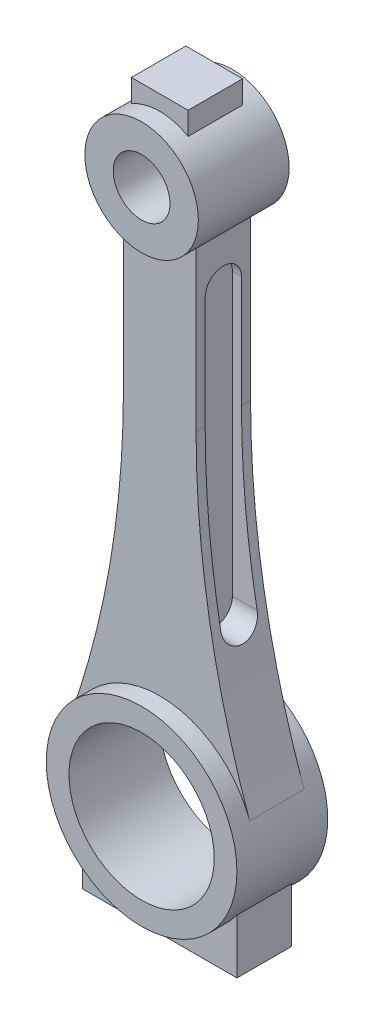
ISO-10303-21;
HEADER;
FILE_DESCRIPTION(('STEP AP214'),'2;1');
FILE_NAME('part.step','',(''),(''),'','','');
FILE_SCHEMA(('AUTOMOTIVE_DESIGN { 1 0 10303 214 1 1 1 1 }'));
ENDSEC;
DATA;
#1=APPLICATION_CONTEXT('core data for automotive mechanical design processes');
#2=APPLICATION_PROTOCOL_DEFINITION('international standard','automotive_design',2000,#1);
#3=PRODUCT_CONTEXT('',#1,'mechanical');
#4=PRODUCT('Part','Part','',(#3));
#5=PRODUCT_RELATED_PRODUCT_CATEGORY('part','',(#4));
#6=PRODUCT_DEFINITION_FORMATION('','',#4);
#7=PRODUCT_DEFINITION_CONTEXT('part definition',#1,'design');
#8=PRODUCT_DEFINITION('design','',#6,#7);
#9=PRODUCT_DEFINITION_SHAPE('','',#8);
#10=(LENGTH_UNIT() NAMED_UNIT(*) SI_UNIT(.MILLI.,.METRE.));
#11=(NAMED_UNIT(*) PLANE_ANGLE_UNIT() SI_UNIT($,.RADIAN.));
#12=(NAMED_UNIT(*) SI_UNIT($,.STERADIAN.) SOLID_ANGLE_UNIT());
#13=UNCERTAINTY_MEASURE_WITH_UNIT(LENGTH_MEASURE(1.E-05),#10,'distance_accuracy_value','');
#14=(GEOMETRIC_REPRESENTATION_CONTEXT(3) GLOBAL_UNCERTAINTY_ASSIGNED_CONTEXT((#13)) GLOBAL_UNIT_ASSIGNED_CONTEXT((#10,
#11,#12)) REPRESENTATION_CONTEXT('',''));
#15=CARTESIAN_POINT('',(0.,0.,0.));
#16=DIRECTION('',(0.,0.,1.));
#17=DIRECTION('',(1.,0.,0.));
#18=AXIS2_PLACEMENT_3D('',#15,#16,#17);
#19=CARTESIAN_POINT('',(212.132819979024,75.3953136438508,6.));
#20=DIRECTION('',(0.,0.,-1.));
#21=DIRECTION('',(-1.,0.,0.));
#22=AXIS2_PLACEMENT_3D('',#19,#20,#21);
#23=CYLINDRICAL_SURFACE('',#22,204.132819979024);
#24=CARTESIAN_POINT('',(11.4544735884215,38.,-4.00000000000001));
#25=CARTESIAN_POINT('',(11.4757515518411,37.885808633556,-4.00000967356236));
#26=CARTESIAN_POINT('',(11.4971278489319,37.7716411229783,-3.9951101211208));
#27=CARTESIAN_POINT('',(11.5399210356049,37.544152772884,-3.97557755361704));
#28=CARTESIAN_POINT('',(11.5613379239584,37.4308319082382,-3.9609448286138));
#29=CARTESIAN_POINT('',(11.6040518019029,37.2058589467753,-3.92203609087538));
#30=CARTESIAN_POINT('',(11.6253488219802,37.0942064124742,-3.89776265395078));
#31=CARTESIAN_POINT('',(11.6676599337569,36.8733657612217,-3.83975872762631));
#32=CARTESIAN_POINT('',(11.6886740293759,36.7641776101132,-3.80602836938937));
#33=CARTESIAN_POINT('',(11.7510730473326,36.4413470108117,-3.69089420326939));
#34=CARTESIAN_POINT('',(11.7918289081029,36.2323636826891,-3.59553432969808));
#35=CARTESIAN_POINT('',(11.8702126062763,35.833491871712,-3.37027556179513));
#36=CARTESIAN_POINT('',(11.9078413597511,35.643597793309,-3.24038682968163));
#37=CARTESIAN_POINT('',(11.9784728244352,35.2894796680367,-2.950436910244));
#38=CARTESIAN_POINT('',(12.0115036519544,35.1250988255321,-2.79057453802655));
#39=CARTESIAN_POINT('',(12.0720036427705,34.8256035029567,-2.44449926104124));
#40=CARTESIAN_POINT('',(12.0994724370193,34.6904909648341,-2.25828460915734));
#41=CARTESIAN_POINT('',(12.1473413477104,34.4559602912754,-1.86832249559897));
#42=CARTESIAN_POINT('',(12.1678582991115,34.3559510460777,-1.66494499104501));
#43=CARTESIAN_POINT('',(12.201667760202,34.1915558050774,-1.24372237948288));
#44=CARTESIAN_POINT('',(12.2149615713728,34.1271633917176,-1.02587988675161));
#45=CARTESIAN_POINT('',(12.2336033492388,34.0369591960168,-0.586274812122712));
#46=CARTESIAN_POINT('',(12.2390950212482,34.0104496060439,-0.36466133556186));
#47=CARTESIAN_POINT('',(12.2423732155318,33.9946184843633,0.0799443502249376));
#48=CARTESIAN_POINT('',(12.2401601145853,34.0052951341723,0.302936491499031));
#49=CARTESIAN_POINT('',(12.2281765408432,34.0632127244266,0.741781925824313));
#50=CARTESIAN_POINT('',(12.2184766498272,34.1101121767817,0.957682365575701));
#51=CARTESIAN_POINT('',(12.1919895794175,34.2385791029979,1.37844153266758));
#52=CARTESIAN_POINT('',(12.1752023313576,34.3201469127454,1.58330015300714));
#53=CARTESIAN_POINT('',(12.1350793834177,34.5159552856904,1.977397761575));
#54=CARTESIAN_POINT('',(12.1117098081663,34.6303649264095,2.16654921549122));
#55=CARTESIAN_POINT('',(12.0593260749272,34.8882465100265,2.52297125984127));
#56=CARTESIAN_POINT('',(12.0303117725959,35.0317191961119,2.69024129055298));
#57=CARTESIAN_POINT('',(11.9671383735568,35.3461665633751,3.00114206510914));
#58=CARTESIAN_POINT('',(11.9329025496515,35.5175545383741,3.14433904981939));
#59=CARTESIAN_POINT('',(11.8607975408037,35.8812712267655,3.40006280722764));
#60=CARTESIAN_POINT('',(11.8229268395297,36.0736086840292,3.51257670427656));
#61=CARTESIAN_POINT('',(11.744011046999,36.4777513253325,3.70593438635491));
#62=CARTESIAN_POINT('',(11.7029182624971,36.6898643551292,3.78611370956408));
#63=CARTESIAN_POINT('',(11.619535719839,37.1241795414682,3.90944320644274));
#64=CARTESIAN_POINT('',(11.5772477716993,37.3463667203578,3.95264656840455));
#65=CARTESIAN_POINT('',(11.5215540274852,37.6417241762258,3.98457340087694));
#66=CARTESIAN_POINT('',(11.5080944382148,37.7133147532121,3.99036111817268));
#67=CARTESIAN_POINT('',(11.481236818834,37.8565916807734,3.99806924003837));
#68=CARTESIAN_POINT('',(11.4678387235409,37.9282776734255,3.99999606757804));
#69=CARTESIAN_POINT('',(11.4544735884215,38.,3.99999999999999));
#70=B_SPLINE_CURVE_WITH_KNOTS('',3,(#24,#25,#26,#27,#28,#29,#30,#31,#32,#33,#34,#35,#36,#37,#38,
#39,#40,#41,#42,#43,#44,#45,#46,#47,#48,#49,#50,#51,#52,#53,#54,#55,#56,#57,#58,#59,#60,#61,#62,
#63,#64,#65,#66,#67,#68,#69),.UNSPECIFIED.,.F.,.F.,(4,2,2,2,2,2,2,2,2,2,2,2,2,2,2,2,2,2,2,2,2,2,
4),(0.,0.348357600629768,0.696704820295746,1.044959030908,1.39320841164154,2.0894785742732,
2.78554404346983,3.47714614167072,4.16879411353829,4.84816302804555,5.52740949173435,
6.19397531687088,6.86050854603355,7.52083364695974,8.18116514562693,8.84495910470897,
9.508770040179,10.1834922182609,10.8584970981523,11.546741507572,12.2339942357505,
12.4531452672714,12.6719314158043),.UNSPECIFIED.);
#71=CARTESIAN_POINT('',(11.4544735884215,38.,-4.00000000000001));
#72=VERTEX_POINT('',#71);
#73=CARTESIAN_POINT('',(11.4544735884215,38.,3.99999999999999));
#74=VERTEX_POINT('',#73);
#75=EDGE_CURVE('E482',#72,#74,#70,.T.);
#76=ORIENTED_EDGE('',*,*,#75,.T.);
#77=CARTESIAN_POINT('',(212.132819979024,75.3953136438508,4.));
#78=DIRECTION('',(0.,0.,-1.));
#79=DIRECTION('',(0.,1.,0.));
#80=AXIS2_PLACEMENT_3D('',#77,#78,#79);
#81=CIRCLE('',#80,204.132819979024);
#82=CARTESIAN_POINT('',(8.00000000000001,75.3953136438507,4.));
#83=VERTEX_POINT('',#82);
#84=EDGE_CURVE('E277',#74,#83,#81,.T.);
#85=ORIENTED_EDGE('',*,*,#84,.T.);
#86=DIRECTION('',(0.,0.,-1.));
#87=VECTOR('',#86,1.);
#88=CARTESIAN_POINT('',(8.00000000000001,75.3953136438507,6.));
#89=LINE('',#88,#87);
#90=CARTESIAN_POINT('',(8.00000000000001,75.3953136438507,6.));
#91=VERTEX_POINT('',#90);
#92=EDGE_CURVE('E451',#91,#83,#89,.T.);
#93=ORIENTED_EDGE('',*,*,#92,.F.);
#94=CARTESIAN_POINT('',(212.132819979024,75.3953136438508,6.));
#95=DIRECTION('',(0.,0.,1.));
#96=DIRECTION('',(1.,0.,0.));
#97=AXIS2_PLACEMENT_3D('',#94,#95,#96);
#98=CIRCLE('',#97,204.132819979024);
#99=CARTESIAN_POINT('',(19.7873824881444,7.03274443356765,6.));
#100=VERTEX_POINT('',#99);
#101=EDGE_CURVE('E387',#91,#100,#98,.T.);
#102=ORIENTED_EDGE('',*,*,#101,.T.);
#103=DIRECTION('',(0.,0.,-1.));
#104=VECTOR('',#103,1.);
#105=CARTESIAN_POINT('',(19.7873824881444,7.03274443356765,6.));
#106=LINE('',#105,#104);
#107=CARTESIAN_POINT('',(19.7873824881444,7.03274443356765,-6.));
#108=VERTEX_POINT('',#107);
#109=EDGE_CURVE('E409',#100,#108,#106,.T.);
#110=ORIENTED_EDGE('',*,*,#109,.T.);
#111=CARTESIAN_POINT('',(212.132819979024,75.3953136438508,-6.));
#112=DIRECTION('',(0.,0.,1.));
#113=DIRECTION('',(1.,0.,0.));
#114=AXIS2_PLACEMENT_3D('',#111,#112,#113);
#115=CIRCLE('',#114,204.132819979024);
#116=CARTESIAN_POINT('',(8.00000000000001,75.3953136438507,-6.));
#117=VERTEX_POINT('',#116);
#118=EDGE_CURVE('E380',#117,#108,#115,.T.);
#119=ORIENTED_EDGE('',*,*,#118,.F.);
#120=CARTESIAN_POINT('',(8.00000000000001,75.3953136438507,-4.));
#121=VERTEX_POINT('',#120);
#122=EDGE_CURVE('E450',#121,#117,#89,.T.);
#123=ORIENTED_EDGE('',*,*,#122,.F.);
#124=CARTESIAN_POINT('',(212.132819979024,75.3953136438508,-4.00000000000001));
#125=DIRECTION('',(0.,0.,1.));
#126=DIRECTION('',(0.,-1.,0.));
#127=AXIS2_PLACEMENT_3D('',#124,#125,#126);
#128=CIRCLE('',#127,204.132819979024);
#129=EDGE_CURVE('E65',#121,#72,#128,.T.);
#130=ORIENTED_EDGE('',*,*,#129,.T.);
#131=EDGE_LOOP('',(#76,#85,#93,#102,#110,#119,#123,#130));
#132=FACE_BOUND('',#131,.T.);
#133=ADVANCED_FACE('F41',(#132),#23,.F.);
#134=CARTESIAN_POINT('',(8.00000000000003,0.,6.));
#135=DIRECTION('',(1.,0.,0.));
#136=DIRECTION('',(0.,1.,0.));
#137=AXIS2_PLACEMENT_3D('',#134,#135,#136);
#138=PLANE('',#137);
#139=ORIENTED_EDGE('',*,*,#92,.T.);
#140=DIRECTION('',(0.,1.,0.));
#141=VECTOR('',#140,1.);
#142=CARTESIAN_POINT('',(8.00000000000003,0.,3.99999999999999));
#143=LINE('',#142,#141);
#144=CARTESIAN_POINT('',(8.00000000000002,100.,4.));
#145=VERTEX_POINT('',#144);
#146=EDGE_CURVE('E478',#83,#145,#143,.T.);
#147=ORIENTED_EDGE('',*,*,#146,.T.);
#148=CARTESIAN_POINT('',(8.00000000000001,100.,0.));
#149=DIRECTION('',(1.,0.,0.));
#150=DIRECTION('',(0.,1.,0.));
#151=AXIS2_PLACEMENT_3D('',#148,#149,#150);
#152=CIRCLE('',#151,4.);
#153=CARTESIAN_POINT('',(8.00000000000002,100.,-4.));
#154=VERTEX_POINT('',#153);
#155=EDGE_CURVE('E474',#145,#154,#152,.F.);
#156=ORIENTED_EDGE('',*,*,#155,.T.);
#157=DIRECTION('',(0.,-1.,0.));
#158=VECTOR('',#157,1.);
#159=CARTESIAN_POINT('',(8.00000000000003,0.,-4.00000000000001));
#160=LINE('',#159,#158);
#161=EDGE_CURVE('E465',#154,#121,#160,.T.);
#162=ORIENTED_EDGE('',*,*,#161,.T.);
#163=ORIENTED_EDGE('',*,*,#122,.T.);
#164=DIRECTION('',(0.,-1.,0.));
#165=VECTOR('',#164,1.);
#166=CARTESIAN_POINT('',(8.00000000000003,0.,-6.));
#167=LINE('',#166,#165);
#168=CARTESIAN_POINT('',(8.00000000000001,110.395313643851,-6.));
#169=VERTEX_POINT('',#168);
#170=EDGE_CURVE('E413',#169,#117,#167,.T.);
#171=ORIENTED_EDGE('',*,*,#170,.F.);
#172=DIRECTION('',(0.,0.,-1.));
#173=VECTOR('',#172,1.);
#174=CARTESIAN_POINT('',(8.00000000000001,110.395313643851,6.));
#175=LINE('',#174,#173);
#176=CARTESIAN_POINT('',(8.00000000000001,110.395313643851,6.));
#177=VERTEX_POINT('',#176);
#178=EDGE_CURVE('E447',#177,#169,#175,.T.);
#179=ORIENTED_EDGE('',*,*,#178,.F.);
#180=DIRECTION('',(0.,-1.,0.));
#181=VECTOR('',#180,1.);
#182=CARTESIAN_POINT('',(8.00000000000003,0.,6.));
#183=LINE('',#182,#181);
#184=EDGE_CURVE('E391',#177,#91,#183,.T.);
#185=ORIENTED_EDGE('',*,*,#184,.T.);
#186=EDGE_LOOP('',(#139,#147,#156,#162,#163,#171,#179,#185));
#187=FACE_BOUND('',#186,.T.);
#188=ADVANCED_FACE('F609',(#187),#138,.T.);
#189=CARTESIAN_POINT('',(0.,120.,10.));
#190=DIRECTION('',(0.,0.,-1.));
#191=DIRECTION('',(-1.,0.,0.));
#192=AXIS2_PLACEMENT_3D('',#189,#190,#191);
#193=CYLINDRICAL_SURFACE('',#192,6.25);
#194=CARTESIAN_POINT('',(0.,120.,10.));
#195=DIRECTION('',(0.,0.,1.));
#196=DIRECTION('',(1.,0.,0.));
#197=AXIS2_PLACEMENT_3D('',#194,#195,#196);
#198=CIRCLE('',#197,6.25);
#199=CARTESIAN_POINT('',(6.25,120.,10.));
#200=VERTEX_POINT('',#199);
#201=EDGE_CURVE('E456',#200,#200,#198,.T.);
#202=ORIENTED_EDGE('',*,*,#201,.T.);
#203=EDGE_LOOP('',(#202));
#204=FACE_BOUND('',#203,.T.);
#205=CARTESIAN_POINT('',(0.,120.,-10.));
#206=DIRECTION('',(0.,0.,1.));
#207=DIRECTION('',(1.,0.,0.));
#208=AXIS2_PLACEMENT_3D('',#205,#206,#207);
#209=CIRCLE('',#208,6.25);
#210=CARTESIAN_POINT('',(6.25,120.,-10.));
#211=VERTEX_POINT('',#210);
#212=EDGE_CURVE('E455',#211,#211,#209,.T.);
#213=ORIENTED_EDGE('',*,*,#212,.F.);
#214=EDGE_LOOP('',(#213));
#215=FACE_BOUND('',#214,.T.);
#216=ADVANCED_FACE('F43',(#204,#215),#193,.F.);
#217=CARTESIAN_POINT('',(0.,120.,10.));
#218=DIRECTION('',(0.,0.,-1.));
#219=DIRECTION('',(-1.,0.,0.));
#220=AXIS2_PLACEMENT_3D('',#217,#218,#219);
#221=CYLINDRICAL_SURFACE('',#220,12.5);
#222=DIRECTION('',(0.,0.,-1.));
#223=VECTOR('',#222,1.);
#224=CARTESIAN_POINT('',(6.25000000000001,130.825317547305,6.));
#225=LINE('',#224,#223);
#226=CARTESIAN_POINT('',(6.25000000000001,130.825317547305,6.));
#227=VERTEX_POINT('',#226);
#228=CARTESIAN_POINT('',(6.25,130.825317547305,-6.));
#229=VERTEX_POINT('',#228);
#230=EDGE_CURVE('E366',#227,#229,#225,.T.);
#231=ORIENTED_EDGE('',*,*,#230,.F.);
#232=CARTESIAN_POINT('',(0.,120.,6.));
#233=DIRECTION('',(0.,0.,1.));
#234=DIRECTION('',(1.,0.,0.));
#235=AXIS2_PLACEMENT_3D('',#232,#233,#234);
#236=CIRCLE('',#235,12.5);
#237=CARTESIAN_POINT('',(-6.25,130.825317547305,6.));
#238=VERTEX_POINT('',#237);
#239=EDGE_CURVE('E327',#227,#238,#236,.T.);
#240=ORIENTED_EDGE('',*,*,#239,.T.);
#241=DIRECTION('',(0.,0.,-1.));
#242=VECTOR('',#241,1.);
#243=CARTESIAN_POINT('',(-6.25,130.825317547305,6.));
#244=LINE('',#243,#242);
#245=CARTESIAN_POINT('',(-6.25,130.825317547305,-6.));
#246=VERTEX_POINT('',#245);
#247=EDGE_CURVE('E343',#238,#246,#244,.T.);
#248=ORIENTED_EDGE('',*,*,#247,.T.);
#249=CARTESIAN_POINT('',(0.,120.,-6.));
#250=DIRECTION('',(0.,0.,1.));
#251=DIRECTION('',(1.,0.,0.));
#252=AXIS2_PLACEMENT_3D('',#249,#250,#251);
#253=CIRCLE('',#252,12.5);
#254=EDGE_CURVE('E326',#229,#246,#253,.T.);
#255=ORIENTED_EDGE('',*,*,#254,.F.);
#256=EDGE_LOOP('',(#231,#240,#248,#255));
#257=FACE_BOUND('',#256,.T.);
#258=DIRECTION('',(0.,0.,-1.));
#259=VECTOR('',#258,1.);
#260=CARTESIAN_POINT('',(-8.,110.395313643851,6.));
#261=LINE('',#260,#259);
#262=CARTESIAN_POINT('',(-8.,110.395313643851,6.));
#263=VERTEX_POINT('',#262);
#264=CARTESIAN_POINT('',(-8.,110.395313643851,-6.));
#265=VERTEX_POINT('',#264);
#266=EDGE_CURVE('E443',#263,#265,#261,.T.);
#267=ORIENTED_EDGE('',*,*,#266,.F.);
#268=CARTESIAN_POINT('',(0.,120.,6.));
#269=DIRECTION('',(0.,0.,1.));
#270=DIRECTION('',(1.,0.,0.));
#271=AXIS2_PLACEMENT_3D('',#268,#269,#270);
#272=CIRCLE('',#271,12.5);
#273=EDGE_CURVE('E396',#263,#177,#272,.T.);
#274=ORIENTED_EDGE('',*,*,#273,.T.);
#275=ORIENTED_EDGE('',*,*,#178,.T.);
#276=CARTESIAN_POINT('',(0.,120.,-6.));
#277=DIRECTION('',(0.,0.,1.));
#278=DIRECTION('',(1.,0.,0.));
#279=AXIS2_PLACEMENT_3D('',#276,#277,#278);
#280=CIRCLE('',#279,12.5);
#281=EDGE_CURVE('E417',#265,#169,#280,.T.);
#282=ORIENTED_EDGE('',*,*,#281,.F.);
#283=EDGE_LOOP('',(#267,#274,#275,#282));
#284=FACE_BOUND('',#283,.T.);
#285=CARTESIAN_POINT('',(0.,120.,10.));
#286=DIRECTION('',(0.,0.,1.));
#287=DIRECTION('',(1.,0.,0.));
#288=AXIS2_PLACEMENT_3D('',#285,#286,#287);
#289=CIRCLE('',#288,12.5);
#290=CARTESIAN_POINT('',(12.5,120.,10.));
#291=VERTEX_POINT('',#290);
#292=EDGE_CURVE('E460',#291,#291,#289,.T.);
#293=ORIENTED_EDGE('',*,*,#292,.F.);
#294=EDGE_LOOP('',(#293));
#295=FACE_BOUND('',#294,.T.);
#296=CARTESIAN_POINT('',(0.,120.,-10.));
#297=DIRECTION('',(0.,0.,1.));
#298=DIRECTION('',(1.,0.,0.));
#299=AXIS2_PLACEMENT_3D('',#296,#297,#298);
#300=CIRCLE('',#299,12.5);
#301=CARTESIAN_POINT('',(12.5,120.,-10.));
#302=VERTEX_POINT('',#301);
#303=EDGE_CURVE('E461',#302,#302,#300,.T.);
#304=ORIENTED_EDGE('',*,*,#303,.T.);
#305=EDGE_LOOP('',(#304));
#306=FACE_BOUND('',#305,.T.);
#307=ADVANCED_FACE('F644',(#257,#284,#295,#306),#221,.T.);
#308=CARTESIAN_POINT('',(0.,0.,10.));
#309=DIRECTION('',(0.,0.,1.));
#310=DIRECTION('',(1.,0.,0.));
#311=AXIS2_PLACEMENT_3D('',#308,#309,#310);
#312=PLANE('',#311);
#313=ORIENTED_EDGE('',*,*,#201,.F.);
#314=EDGE_LOOP('',(#313));
#315=FACE_BOUND('',#314,.T.);
#316=ORIENTED_EDGE('',*,*,#292,.T.);
#317=EDGE_LOOP('',(#316));
#318=FACE_BOUND('',#317,.T.);
#319=ADVANCED_FACE('F826',(#315,#318),#312,.T.);
#320=CARTESIAN_POINT('',(0.,0.,-10.));
#321=DIRECTION('',(0.,0.,1.));
#322=DIRECTION('',(1.,0.,0.));
#323=AXIS2_PLACEMENT_3D('',#320,#321,#322);
#324=PLANE('',#323);
#325=ORIENTED_EDGE('',*,*,#212,.T.);
#326=EDGE_LOOP('',(#325));
#327=FACE_BOUND('',#326,.T.);
#328=ORIENTED_EDGE('',*,*,#303,.F.);
#329=EDGE_LOOP('',(#328));
#330=FACE_BOUND('',#329,.T.);
#331=ADVANCED_FACE('F835',(#327,#330),#324,.F.);
#332=CARTESIAN_POINT('',(-7.99999999999999,0.,6.));
#333=DIRECTION('',(1.,0.,0.));
#334=DIRECTION('',(0.,1.,0.));
#335=AXIS2_PLACEMENT_3D('',#332,#333,#334);
#336=PLANE('',#335);
#337=DIRECTION('',(0.,0.,-1.));
#338=VECTOR('',#337,1.);
#339=CARTESIAN_POINT('',(-7.99999999999999,75.3953136438507,6.));
#340=LINE('',#339,#338);
#341=CARTESIAN_POINT('',(-7.99999999999995,75.3953136438507,-4.00000000000001));
#342=VERTEX_POINT('',#341);
#343=CARTESIAN_POINT('',(-7.99999999999999,75.3953136438507,-6.));
#344=VERTEX_POINT('',#343);
#345=EDGE_CURVE('E438',#342,#344,#340,.T.);
#346=ORIENTED_EDGE('',*,*,#345,.F.);
#347=DIRECTION('',(0.,1.,0.));
#348=VECTOR('',#347,1.);
#349=CARTESIAN_POINT('',(-7.99999999999999,0.,-4.00000000000001));
#350=LINE('',#349,#348);
#351=CARTESIAN_POINT('',(-8.,100.,-4.));
#352=VERTEX_POINT('',#351);
#353=EDGE_CURVE('E243',#342,#352,#350,.T.);
#354=ORIENTED_EDGE('',*,*,#353,.T.);
#355=CARTESIAN_POINT('',(-8.,100.,0.));
#356=DIRECTION('',(1.,0.,0.));
#357=DIRECTION('',(0.,1.,0.));
#358=AXIS2_PLACEMENT_3D('',#355,#356,#357);
#359=CIRCLE('',#358,4.);
#360=CARTESIAN_POINT('',(-8.,100.,4.));
#361=VERTEX_POINT('',#360);
#362=EDGE_CURVE('E11',#352,#361,#359,.T.);
#363=ORIENTED_EDGE('',*,*,#362,.T.);
#364=DIRECTION('',(0.,-1.,0.));
#365=VECTOR('',#364,1.);
#366=CARTESIAN_POINT('',(-7.99999999999999,0.,3.99999999999999));
#367=LINE('',#366,#365);
#368=CARTESIAN_POINT('',(-7.99999999999995,75.3953136438507,4.));
#369=VERTEX_POINT('',#368);
#370=EDGE_CURVE('E207',#361,#369,#367,.T.);
#371=ORIENTED_EDGE('',*,*,#370,.T.);
#372=CARTESIAN_POINT('',(-7.99999999999999,75.3953136438507,6.));
#373=VERTEX_POINT('',#372);
#374=EDGE_CURVE('E439',#373,#369,#340,.T.);
#375=ORIENTED_EDGE('',*,*,#374,.F.);
#376=DIRECTION('',(0.,-1.,0.));
#377=VECTOR('',#376,1.);
#378=CARTESIAN_POINT('',(-7.99999999999999,0.,6.));
#379=LINE('',#378,#377);
#380=EDGE_CURVE('E399',#263,#373,#379,.T.);
#381=ORIENTED_EDGE('',*,*,#380,.F.);
#382=ORIENTED_EDGE('',*,*,#266,.T.);
#383=DIRECTION('',(0.,-1.,0.));
#384=VECTOR('',#383,1.);
#385=CARTESIAN_POINT('',(-7.99999999999999,0.,-6.));
#386=LINE('',#385,#384);
#387=EDGE_CURVE('E421',#265,#344,#386,.T.);
#388=ORIENTED_EDGE('',*,*,#387,.T.);
#389=EDGE_LOOP('',(#346,#354,#363,#371,#375,#381,#382,#388));
#390=FACE_BOUND('',#389,.T.);
#391=ADVANCED_FACE('F581',(#390),#336,.F.);
#392=CARTESIAN_POINT('',(-212.132819979024,75.3953136438507,6.));
#393=DIRECTION('',(0.,0.,-1.));
#394=DIRECTION('',(-1.,0.,0.));
#395=AXIS2_PLACEMENT_3D('',#392,#393,#394);
#396=CYLINDRICAL_SURFACE('',#395,204.132819979024);
#397=CARTESIAN_POINT('',(-11.4544735884215,38.,3.99999999999999));
#398=CARTESIAN_POINT('',(-11.4757515518411,37.885808633556,4.00000967356234));
#399=CARTESIAN_POINT('',(-11.4971278489319,37.7716411229783,3.99511012112078));
#400=CARTESIAN_POINT('',(-11.5399210356049,37.544152772884,3.97557755361703));
#401=CARTESIAN_POINT('',(-11.5613379239584,37.4308319082382,3.96094482861378));
#402=CARTESIAN_POINT('',(-11.6040518019029,37.2058589467753,3.92203609087537));
#403=CARTESIAN_POINT('',(-11.6253488219802,37.0942064124742,3.89776265395076));
#404=CARTESIAN_POINT('',(-11.6676599337568,36.8733657612217,3.83975872762629));
#405=CARTESIAN_POINT('',(-11.6886740293759,36.7641776101132,3.80602836938935));
#406=CARTESIAN_POINT('',(-11.7510730473326,36.4413470108117,3.69089420326937));
#407=CARTESIAN_POINT('',(-11.7918289081029,36.2323636826891,3.59553432969806));
#408=CARTESIAN_POINT('',(-11.8702126062763,35.833491871712,3.37027556179512));
#409=CARTESIAN_POINT('',(-11.9078413597511,35.643597793309,3.24038682968162));
#410=CARTESIAN_POINT('',(-11.9784728244352,35.2894796680367,2.95043691024399));
#411=CARTESIAN_POINT('',(-12.0115036519544,35.1250988255321,2.79057453802654));
#412=CARTESIAN_POINT('',(-12.0720036427705,34.8256035029567,2.44449926104123));
#413=CARTESIAN_POINT('',(-12.0994724370193,34.6904909648341,2.25828460915732));
#414=CARTESIAN_POINT('',(-12.1473413477104,34.4559602912754,1.86832249559895));
#415=CARTESIAN_POINT('',(-12.1678582991114,34.3559510460777,1.66494499104499));
#416=CARTESIAN_POINT('',(-12.201667760202,34.1915558050774,1.24372237948286));
#417=CARTESIAN_POINT('',(-12.2149615713728,34.1271633917176,1.02587988675159));
#418=CARTESIAN_POINT('',(-12.2336033492387,34.0369591960168,0.586274812122691));
#419=CARTESIAN_POINT('',(-12.2390950212481,34.0104496060439,0.364661335561841));
#420=CARTESIAN_POINT('',(-12.2423732155318,33.9946184843632,-0.0799443502249548));
#421=CARTESIAN_POINT('',(-12.2401601145852,34.0052951341723,-0.302936491499048));
#422=CARTESIAN_POINT('',(-12.2281765408432,34.0632127244266,-0.741781925824327));
#423=CARTESIAN_POINT('',(-12.2184766498271,34.1101121767817,-0.957682365575715));
#424=CARTESIAN_POINT('',(-12.1919895794175,34.2385791029979,-1.37844153266759));
#425=CARTESIAN_POINT('',(-12.1752023313576,34.3201469127454,-1.58330015300716));
#426=CARTESIAN_POINT('',(-12.1350793834177,34.5159552856904,-1.97739776157502));
#427=CARTESIAN_POINT('',(-12.1117098081663,34.6303649264095,-2.16654921549124));
#428=CARTESIAN_POINT('',(-12.0593260749272,34.8882465100265,-2.52297125984129));
#429=CARTESIAN_POINT('',(-12.0303117725958,35.0317191961119,-2.690241290553));
#430=CARTESIAN_POINT('',(-11.9671383735568,35.3461665633751,-3.00114206510915));
#431=CARTESIAN_POINT('',(-11.9329025496514,35.5175545383741,-3.1443390498194));
#432=CARTESIAN_POINT('',(-11.8607975408037,35.8812712267655,-3.40006280722766));
#433=CARTESIAN_POINT('',(-11.8229268395298,36.0736086840292,-3.51257670427658));
#434=CARTESIAN_POINT('',(-11.744011046999,36.4777513253325,-3.70593438635493));
#435=CARTESIAN_POINT('',(-11.702918262497,36.6898643551292,-3.78611370956409));
#436=CARTESIAN_POINT('',(-11.6195357198389,37.1241795414682,-3.90944320644275));
#437=CARTESIAN_POINT('',(-11.5772477716992,37.3463667203578,-3.95264656840456));
#438=CARTESIAN_POINT('',(-11.5215540274852,37.6417241762258,-3.98457340087695));
#439=CARTESIAN_POINT('',(-11.5080944382148,37.713314753212,-3.9903611181727));
#440=CARTESIAN_POINT('',(-11.4812368188341,37.8565916807734,-3.99806924003838));
#441=CARTESIAN_POINT('',(-11.4678387235409,37.9282776734255,-3.99999606757806));
#442=CARTESIAN_POINT('',(-11.4544735884214,38.,-4.00000000000001));
#443=B_SPLINE_CURVE_WITH_KNOTS('',3,(#397,#398,#399,#400,#401,#402,#403,#404,#405,#406,#407,
#408,#409,#410,#411,#412,#413,#414,#415,#416,#417,#418,#419,#420,#421,#422,#423,#424,#425,#426,
#427,#428,#429,#430,#431,#432,#433,#434,#435,#436,#437,#438,#439,#440,#441,#442),.UNSPECIFIED.,
.F.,.F.,(4,2,2,2,2,2,2,2,2,2,2,2,2,2,2,2,2,2,2,2,2,2,4),(0.,0.348357600629778,0.696704820295753,
1.044959030908,1.39320841164154,2.0894785742732,2.78554404346983,3.47714614167072,
4.1687941135383,4.84816302804556,5.52740949173436,6.19397531687089,6.86050854603355,
7.52083364695974,8.18116514562693,8.84495910470897,9.508770040179,10.1834922182609,
10.8584970981523,11.546741507572,12.2339942357505,12.4531452672714,12.6719314158043),.UNSPECIFIED.);
#444=CARTESIAN_POINT('',(-11.4544735884215,38.,3.99999999999999));
#445=VERTEX_POINT('',#444);
#446=CARTESIAN_POINT('',(-11.4544735884215,38.,-4.00000000000001));
#447=VERTEX_POINT('',#446);
#448=EDGE_CURVE('E583',#445,#447,#443,.T.);
#449=ORIENTED_EDGE('',*,*,#448,.T.);
#450=CARTESIAN_POINT('',(-212.132819979024,75.3953136438507,-4.00000000000001));
#451=DIRECTION('',(0.,0.,-1.));
#452=DIRECTION('',(0.,1.,0.));
#453=AXIS2_PLACEMENT_3D('',#450,#451,#452);
#454=CIRCLE('',#453,204.132819979024);
#455=EDGE_CURVE('E50',#447,#342,#454,.F.);
#456=ORIENTED_EDGE('',*,*,#455,.T.);
#457=ORIENTED_EDGE('',*,*,#345,.T.);
#458=CARTESIAN_POINT('',(-212.132819979024,75.3953136438507,-6.));
#459=DIRECTION('',(0.,0.,1.));
#460=DIRECTION('',(1.,0.,0.));
#461=AXIS2_PLACEMENT_3D('',#458,#459,#460);
#462=CIRCLE('',#461,204.132819979024);
#463=CARTESIAN_POINT('',(-19.7873824881444,7.03274443356764,-6.));
#464=VERTEX_POINT('',#463);
#465=EDGE_CURVE('E425',#344,#464,#462,.F.);
#466=ORIENTED_EDGE('',*,*,#465,.T.);
#467=DIRECTION('',(0.,0.,-1.));
#468=VECTOR('',#467,1.);
#469=CARTESIAN_POINT('',(-19.7873824881444,7.03274443356764,6.));
#470=LINE('',#469,#468);
#471=CARTESIAN_POINT('',(-19.7873824881444,7.03274443356764,6.));
#472=VERTEX_POINT('',#471);
#473=EDGE_CURVE('E435',#472,#464,#470,.T.);
#474=ORIENTED_EDGE('',*,*,#473,.F.);
#475=CARTESIAN_POINT('',(-212.132819979024,75.3953136438507,6.));
#476=DIRECTION('',(0.,0.,1.));
#477=DIRECTION('',(1.,0.,0.));
#478=AXIS2_PLACEMENT_3D('',#475,#476,#477);
#479=CIRCLE('',#478,204.132819979024);
#480=EDGE_CURVE('E402',#373,#472,#479,.F.);
#481=ORIENTED_EDGE('',*,*,#480,.F.);
#482=ORIENTED_EDGE('',*,*,#374,.T.);
#483=CARTESIAN_POINT('',(-212.132819979024,75.3953136438507,4.));
#484=DIRECTION('',(0.,0.,1.));
#485=DIRECTION('',(0.,-1.,0.));
#486=AXIS2_PLACEMENT_3D('',#483,#484,#485);
#487=CIRCLE('',#486,204.132819979024);
#488=EDGE_CURVE('E492',#369,#445,#487,.F.);
#489=ORIENTED_EDGE('',*,*,#488,.T.);
#490=EDGE_LOOP('',(#449,#456,#457,#466,#474,#481,#482,#489));
#491=FACE_BOUND('',#490,.T.);
#492=ADVANCED_FACE('F573',(#491),#396,.F.);
#493=CARTESIAN_POINT('',(0.,0.,6.));
#494=DIRECTION('',(0.,0.,1.));
#495=DIRECTION('',(1.,0.,0.));
#496=AXIS2_PLACEMENT_3D('',#493,#494,#495);
#497=PLANE('',#496);
#498=ORIENTED_EDGE('',*,*,#101,.F.);
#499=ORIENTED_EDGE('',*,*,#184,.F.);
#500=ORIENTED_EDGE('',*,*,#273,.F.);
#501=ORIENTED_EDGE('',*,*,#380,.T.);
#502=ORIENTED_EDGE('',*,*,#480,.T.);
#503=CARTESIAN_POINT('',(0.,0.,6.));
#504=DIRECTION('',(0.,0.,1.));
#505=DIRECTION('',(1.,0.,0.));
#506=AXIS2_PLACEMENT_3D('',#503,#504,#505);
#507=CIRCLE('',#506,21.);
#508=EDGE_CURVE('E406',#100,#472,#507,.T.);
#509=ORIENTED_EDGE('',*,*,#508,.F.);
#510=EDGE_LOOP('',(#498,#499,#500,#501,#502,#509));
#511=FACE_BOUND('',#510,.T.);
#512=ADVANCED_FACE('F570',(#511),#497,.T.);
#513=CARTESIAN_POINT('',(0.,0.,-6.));
#514=DIRECTION('',(0.,0.,1.));
#515=DIRECTION('',(1.,0.,0.));
#516=AXIS2_PLACEMENT_3D('',#513,#514,#515);
#517=PLANE('',#516);
#518=ORIENTED_EDGE('',*,*,#118,.T.);
#519=CARTESIAN_POINT('',(0.,0.,-6.));
#520=DIRECTION('',(0.,0.,1.));
#521=DIRECTION('',(1.,0.,0.));
#522=AXIS2_PLACEMENT_3D('',#519,#520,#521);
#523=CIRCLE('',#522,21.);
#524=EDGE_CURVE('E392',#108,#464,#523,.T.);
#525=ORIENTED_EDGE('',*,*,#524,.T.);
#526=ORIENTED_EDGE('',*,*,#465,.F.);
#527=ORIENTED_EDGE('',*,*,#387,.F.);
#528=ORIENTED_EDGE('',*,*,#281,.T.);
#529=ORIENTED_EDGE('',*,*,#170,.T.);
#530=EDGE_LOOP('',(#518,#525,#526,#527,#528,#529));
#531=FACE_BOUND('',#530,.T.);
#532=ADVANCED_FACE('F568',(#531),#517,.F.);
#533=CARTESIAN_POINT('',(0.,0.,10.));
#534=DIRECTION('',(0.,0.,-1.));
#535=DIRECTION('',(-1.,0.,0.));
#536=AXIS2_PLACEMENT_3D('',#533,#534,#535);
#537=CYLINDRICAL_SURFACE('',#536,21.);
#538=DIRECTION('',(0.,0.,-1.));
#539=VECTOR('',#538,1.);
#540=CARTESIAN_POINT('',(-17.,-12.328828005938,6.));
#541=LINE('',#540,#539);
#542=CARTESIAN_POINT('',(-17.,-12.328828005938,6.));
#543=VERTEX_POINT('',#542);
#544=CARTESIAN_POINT('',(-17.,-12.328828005938,-6.));
#545=VERTEX_POINT('',#544);
#546=EDGE_CURVE('E315',#543,#545,#541,.T.);
#547=ORIENTED_EDGE('',*,*,#546,.F.);
#548=CARTESIAN_POINT('',(0.,0.,6.));
#549=DIRECTION('',(0.,0.,1.));
#550=DIRECTION('',(1.,0.,0.));
#551=AXIS2_PLACEMENT_3D('',#548,#549,#550);
#552=CIRCLE('',#551,21.);
#553=CARTESIAN_POINT('',(17.,-12.328828005938,6.));
#554=VERTEX_POINT('',#553);
#555=EDGE_CURVE('E291',#543,#554,#552,.T.);
#556=ORIENTED_EDGE('',*,*,#555,.T.);
#557=DIRECTION('',(0.,0.,-1.));
#558=VECTOR('',#557,1.);
#559=CARTESIAN_POINT('',(17.,-12.328828005938,6.));
#560=LINE('',#559,#558);
#561=CARTESIAN_POINT('',(17.,-12.328828005938,-6.));
#562=VERTEX_POINT('',#561);
#563=EDGE_CURVE('E319',#554,#562,#560,.T.);
#564=ORIENTED_EDGE('',*,*,#563,.T.);
#565=CARTESIAN_POINT('',(0.,0.,-6.));
#566=DIRECTION('',(0.,0.,1.));
#567=DIRECTION('',(1.,0.,0.));
#568=AXIS2_PLACEMENT_3D('',#565,#566,#567);
#569=CIRCLE('',#568,21.);
#570=EDGE_CURVE('E306',#545,#562,#569,.T.);
#571=ORIENTED_EDGE('',*,*,#570,.F.);
#572=EDGE_LOOP('',(#547,#556,#564,#571));
#573=FACE_BOUND('',#572,.T.);
#574=ORIENTED_EDGE('',*,*,#508,.T.);
#575=ORIENTED_EDGE('',*,*,#473,.T.);
#576=ORIENTED_EDGE('',*,*,#524,.F.);
#577=ORIENTED_EDGE('',*,*,#109,.F.);
#578=EDGE_LOOP('',(#574,#575,#576,#577));
#579=FACE_BOUND('',#578,.T.);
#580=CARTESIAN_POINT('',(0.,0.,10.));
#581=DIRECTION('',(0.,0.,1.));
#582=DIRECTION('',(1.,0.,0.));
#583=AXIS2_PLACEMENT_3D('',#580,#581,#582);
#584=CIRCLE('',#583,21.);
#585=CARTESIAN_POINT('',(21.,0.,10.));
#586=VERTEX_POINT('',#585);
#587=EDGE_CURVE('E371',#586,#586,#584,.T.);
#588=ORIENTED_EDGE('',*,*,#587,.F.);
#589=EDGE_LOOP('',(#588));
#590=FACE_BOUND('',#589,.T.);
#591=CARTESIAN_POINT('',(0.,0.,-10.));
#592=DIRECTION('',(0.,0.,1.));
#593=DIRECTION('',(1.,0.,0.));
#594=AXIS2_PLACEMENT_3D('',#591,#592,#593);
#595=CIRCLE('',#594,21.);
#596=CARTESIAN_POINT('',(21.,0.,-10.));
#597=VERTEX_POINT('',#596);
#598=EDGE_CURVE('E370',#597,#597,#595,.T.);
#599=ORIENTED_EDGE('',*,*,#598,.T.);
#600=EDGE_LOOP('',(#599));
#601=FACE_BOUND('',#600,.T.);
#602=ADVANCED_FACE('F564',(#573,#579,#590,#601),#537,.T.);
#603=CARTESIAN_POINT('',(0.,0.,10.));
#604=DIRECTION('',(0.,0.,-1.));
#605=DIRECTION('',(-1.,0.,0.));
#606=AXIS2_PLACEMENT_3D('',#603,#604,#605);
#607=CYLINDRICAL_SURFACE('',#606,16.);
#608=CARTESIAN_POINT('',(0.,0.,10.));
#609=DIRECTION('',(0.,0.,1.));
#610=DIRECTION('',(1.,0.,0.));
#611=AXIS2_PLACEMENT_3D('',#608,#609,#610);
#612=CIRCLE('',#611,16.);
#613=CARTESIAN_POINT('',(16.,0.,10.));
#614=VERTEX_POINT('',#613);
#615=EDGE_CURVE('E375',#614,#614,#612,.T.);
#616=ORIENTED_EDGE('',*,*,#615,.T.);
#617=EDGE_LOOP('',(#616));
#618=FACE_BOUND('',#617,.T.);
#619=CARTESIAN_POINT('',(0.,0.,-10.));
#620=DIRECTION('',(0.,0.,1.));
#621=DIRECTION('',(1.,0.,0.));
#622=AXIS2_PLACEMENT_3D('',#619,#620,#621);
#623=CIRCLE('',#622,16.);
#624=CARTESIAN_POINT('',(16.,0.,-10.));
#625=VERTEX_POINT('',#624);
#626=EDGE_CURVE('E376',#625,#625,#623,.T.);
#627=ORIENTED_EDGE('',*,*,#626,.F.);
#628=EDGE_LOOP('',(#627));
#629=FACE_BOUND('',#628,.T.);
#630=ADVANCED_FACE('F557',(#618,#629),#607,.F.);
#631=CARTESIAN_POINT('',(0.,0.,10.));
#632=DIRECTION('',(0.,0.,1.));
#633=DIRECTION('',(1.,0.,0.));
#634=AXIS2_PLACEMENT_3D('',#631,#632,#633);
#635=PLANE('',#634);
#636=ORIENTED_EDGE('',*,*,#587,.T.);
#637=EDGE_LOOP('',(#636));
#638=FACE_BOUND('',#637,.T.);
#639=ORIENTED_EDGE('',*,*,#615,.F.);
#640=EDGE_LOOP('',(#639));
#641=FACE_BOUND('',#640,.T.);
#642=ADVANCED_FACE('F554',(#638,#641),#635,.T.);
#643=CARTESIAN_POINT('',(0.,0.,-10.));
#644=DIRECTION('',(0.,0.,1.));
#645=DIRECTION('',(1.,0.,0.));
#646=AXIS2_PLACEMENT_3D('',#643,#644,#645);
#647=PLANE('',#646);
#648=ORIENTED_EDGE('',*,*,#598,.F.);
#649=EDGE_LOOP('',(#648));
#650=FACE_BOUND('',#649,.T.);
#651=ORIENTED_EDGE('',*,*,#626,.T.);
#652=EDGE_LOOP('',(#651));
#653=FACE_BOUND('',#652,.T.);
#654=ADVANCED_FACE('F552',(#650,#653),#647,.F.);
#655=CARTESIAN_POINT('',(6.2500000000001,0.,6.));
#656=DIRECTION('',(1.,0.,0.));
#657=DIRECTION('',(0.,1.,0.));
#658=AXIS2_PLACEMENT_3D('',#655,#656,#657);
#659=PLANE('',#658);
#660=DIRECTION('',(0.,-1.,0.));
#661=VECTOR('',#660,1.);
#662=CARTESIAN_POINT('',(6.2500000000001,0.,-6.));
#663=LINE('',#662,#661);
#664=CARTESIAN_POINT('',(6.25,135.825317547305,-6.));
#665=VERTEX_POINT('',#664);
#666=EDGE_CURVE('E347',#665,#229,#663,.T.);
#667=ORIENTED_EDGE('',*,*,#666,.F.);
#668=DIRECTION('',(0.,0.,-1.));
#669=VECTOR('',#668,1.);
#670=CARTESIAN_POINT('',(6.25,135.825317547305,6.));
#671=LINE('',#670,#669);
#672=CARTESIAN_POINT('',(6.25,135.825317547305,6.));
#673=VERTEX_POINT('',#672);
#674=EDGE_CURVE('E363',#673,#665,#671,.T.);
#675=ORIENTED_EDGE('',*,*,#674,.F.);
#676=DIRECTION('',(0.,-1.,0.));
#677=VECTOR('',#676,1.);
#678=CARTESIAN_POINT('',(6.2500000000001,0.,6.));
#679=LINE('',#678,#677);
#680=EDGE_CURVE('E330',#673,#227,#679,.T.);
#681=ORIENTED_EDGE('',*,*,#680,.T.);
#682=ORIENTED_EDGE('',*,*,#230,.T.);
#683=EDGE_LOOP('',(#667,#675,#681,#682));
#684=FACE_BOUND('',#683,.T.);
#685=ADVANCED_FACE('F548',(#684),#659,.T.);
#686=CARTESIAN_POINT('',(0.,135.825317547305,6.));
#687=DIRECTION('',(0.,1.,0.));
#688=DIRECTION('',(0.,0.,1.));
#689=AXIS2_PLACEMENT_3D('',#686,#687,#688);
#690=PLANE('',#689);
#691=DIRECTION('',(1.,0.,0.));
#692=VECTOR('',#691,1.);
#693=CARTESIAN_POINT('',(0.,135.825317547305,-6.));
#694=LINE('',#693,#692);
#695=CARTESIAN_POINT('',(-6.25,135.825317547305,-6.));
#696=VERTEX_POINT('',#695);
#697=EDGE_CURVE('E351',#696,#665,#694,.T.);
#698=ORIENTED_EDGE('',*,*,#697,.F.);
#699=DIRECTION('',(0.,0.,-1.));
#700=VECTOR('',#699,1.);
#701=CARTESIAN_POINT('',(-6.25,135.825317547305,6.));
#702=LINE('',#701,#700);
#703=CARTESIAN_POINT('',(-6.25,135.825317547305,6.));
#704=VERTEX_POINT('',#703);
#705=EDGE_CURVE('E360',#704,#696,#702,.T.);
#706=ORIENTED_EDGE('',*,*,#705,.F.);
#707=DIRECTION('',(1.,0.,0.));
#708=VECTOR('',#707,1.);
#709=CARTESIAN_POINT('',(0.,135.825317547305,6.));
#710=LINE('',#709,#708);
#711=EDGE_CURVE('E335',#704,#673,#710,.T.);
#712=ORIENTED_EDGE('',*,*,#711,.T.);
#713=ORIENTED_EDGE('',*,*,#674,.T.);
#714=EDGE_LOOP('',(#698,#706,#712,#713));
#715=FACE_BOUND('',#714,.T.);
#716=ADVANCED_FACE('F544',(#715),#690,.T.);
#717=CARTESIAN_POINT('',(-6.25,0.,6.));
#718=DIRECTION('',(-1.,0.,0.));
#719=DIRECTION('',(0.,0.,1.));
#720=AXIS2_PLACEMENT_3D('',#717,#718,#719);
#721=PLANE('',#720);
#722=DIRECTION('',(0.,1.,0.));
#723=VECTOR('',#722,1.);
#724=CARTESIAN_POINT('',(-6.25,0.,-6.));
#725=LINE('',#724,#723);
#726=EDGE_CURVE('E331',#246,#696,#725,.T.);
#727=ORIENTED_EDGE('',*,*,#726,.F.);
#728=ORIENTED_EDGE('',*,*,#247,.F.);
#729=DIRECTION('',(0.,1.,0.));
#730=VECTOR('',#729,1.);
#731=CARTESIAN_POINT('',(-6.25,0.,6.));
#732=LINE('',#731,#730);
#733=EDGE_CURVE('E339',#238,#704,#732,.T.);
#734=ORIENTED_EDGE('',*,*,#733,.T.);
#735=ORIENTED_EDGE('',*,*,#705,.T.);
#736=EDGE_LOOP('',(#727,#728,#734,#735));
#737=FACE_BOUND('',#736,.T.);
#738=ADVANCED_FACE('F537',(#737),#721,.T.);
#739=CARTESIAN_POINT('',(0.,0.,6.));
#740=DIRECTION('',(0.,0.,1.));
#741=DIRECTION('',(1.,0.,0.));
#742=AXIS2_PLACEMENT_3D('',#739,#740,#741);
#743=PLANE('',#742);
#744=ORIENTED_EDGE('',*,*,#239,.F.);
#745=ORIENTED_EDGE('',*,*,#680,.F.);
#746=ORIENTED_EDGE('',*,*,#711,.F.);
#747=ORIENTED_EDGE('',*,*,#733,.F.);
#748=EDGE_LOOP('',(#744,#745,#746,#747));
#749=FACE_BOUND('',#748,.T.);
#750=ADVANCED_FACE('F534',(#749),#743,.T.);
#751=CARTESIAN_POINT('',(0.,0.,-6.));
#752=DIRECTION('',(0.,0.,1.));
#753=DIRECTION('',(1.,0.,0.));
#754=AXIS2_PLACEMENT_3D('',#751,#752,#753);
#755=PLANE('',#754);
#756=ORIENTED_EDGE('',*,*,#254,.T.);
#757=ORIENTED_EDGE('',*,*,#726,.T.);
#758=ORIENTED_EDGE('',*,*,#697,.T.);
#759=ORIENTED_EDGE('',*,*,#666,.T.);
#760=EDGE_LOOP('',(#756,#757,#758,#759));
#761=FACE_BOUND('',#760,.T.);
#762=ADVANCED_FACE('F532',(#761),#755,.F.);
#763=CARTESIAN_POINT('',(0.,-24.328828005938,6.));
#764=DIRECTION('',(0.,1.,0.));
#765=DIRECTION('',(-1.,0.,0.));
#766=AXIS2_PLACEMENT_3D('',#763,#764,#765);
#767=PLANE('',#766);
#768=DIRECTION('',(1.,0.,0.));
#769=VECTOR('',#768,1.);
#770=CARTESIAN_POINT('',(0.,-24.328828005938,-6.));
#771=LINE('',#770,#769);
#772=CARTESIAN_POINT('',(-17.,-24.328828005938,-6.));
#773=VERTEX_POINT('',#772);
#774=CARTESIAN_POINT('',(17.,-24.328828005938,-6.));
#775=VERTEX_POINT('',#774);
#776=EDGE_CURVE('E281',#773,#775,#771,.T.);
#777=ORIENTED_EDGE('',*,*,#776,.T.);
#778=DIRECTION('',(0.,0.,-1.));
#779=VECTOR('',#778,1.);
#780=CARTESIAN_POINT('',(17.,-24.328828005938,6.));
#781=LINE('',#780,#779);
#782=CARTESIAN_POINT('',(17.,-24.328828005938,6.));
#783=VERTEX_POINT('',#782);
#784=EDGE_CURVE('E322',#783,#775,#781,.T.);
#785=ORIENTED_EDGE('',*,*,#784,.F.);
#786=DIRECTION('',(1.,0.,0.));
#787=VECTOR('',#786,1.);
#788=CARTESIAN_POINT('',(0.,-24.328828005938,6.));
#789=LINE('',#788,#787);
#790=CARTESIAN_POINT('',(-17.,-24.328828005938,6.));
#791=VERTEX_POINT('',#790);
#792=EDGE_CURVE('E282',#791,#783,#789,.T.);
#793=ORIENTED_EDGE('',*,*,#792,.F.);
#794=DIRECTION('',(0.,0.,-1.));
#795=VECTOR('',#794,1.);
#796=CARTESIAN_POINT('',(-17.,-24.328828005938,6.));
#797=LINE('',#796,#795);
#798=EDGE_CURVE('E298',#791,#773,#797,.T.);
#799=ORIENTED_EDGE('',*,*,#798,.T.);
#800=EDGE_LOOP('',(#777,#785,#793,#799));
#801=FACE_BOUND('',#800,.T.);
#802=ADVANCED_FACE('F528',(#801),#767,.F.);
#803=CARTESIAN_POINT('',(17.,0.,6.));
#804=DIRECTION('',(-1.,0.,0.));
#805=DIRECTION('',(0.,-1.,0.));
#806=AXIS2_PLACEMENT_3D('',#803,#804,#805);
#807=PLANE('',#806);
#808=DIRECTION('',(0.,1.,0.));
#809=VECTOR('',#808,1.);
#810=CARTESIAN_POINT('',(17.,0.,-6.));
#811=LINE('',#810,#809);
#812=EDGE_CURVE('E302',#775,#562,#811,.T.);
#813=ORIENTED_EDGE('',*,*,#812,.T.);
#814=ORIENTED_EDGE('',*,*,#563,.F.);
#815=DIRECTION('',(0.,1.,0.));
#816=VECTOR('',#815,1.);
#817=CARTESIAN_POINT('',(17.,0.,6.));
#818=LINE('',#817,#816);
#819=EDGE_CURVE('E286',#783,#554,#818,.T.);
#820=ORIENTED_EDGE('',*,*,#819,.F.);
#821=ORIENTED_EDGE('',*,*,#784,.T.);
#822=EDGE_LOOP('',(#813,#814,#820,#821));
#823=FACE_BOUND('',#822,.T.);
#824=ADVANCED_FACE('F524',(#823),#807,.F.);
#825=CARTESIAN_POINT('',(-17.,0.,6.));
#826=DIRECTION('',(-1.,0.,0.));
#827=DIRECTION('',(0.,0.,1.));
#828=AXIS2_PLACEMENT_3D('',#825,#826,#827);
#829=PLANE('',#828);
#830=DIRECTION('',(0.,1.,0.));
#831=VECTOR('',#830,1.);
#832=CARTESIAN_POINT('',(-17.,0.,-6.));
#833=LINE('',#832,#831);
#834=EDGE_CURVE('E287',#773,#545,#833,.T.);
#835=ORIENTED_EDGE('',*,*,#834,.F.);
#836=ORIENTED_EDGE('',*,*,#798,.F.);
#837=DIRECTION('',(0.,1.,0.));
#838=VECTOR('',#837,1.);
#839=CARTESIAN_POINT('',(-17.,0.,6.));
#840=LINE('',#839,#838);
#841=EDGE_CURVE('E294',#791,#543,#840,.T.);
#842=ORIENTED_EDGE('',*,*,#841,.T.);
#843=ORIENTED_EDGE('',*,*,#546,.T.);
#844=EDGE_LOOP('',(#835,#836,#842,#843));
#845=FACE_BOUND('',#844,.T.);
#846=ADVANCED_FACE('F517',(#845),#829,.T.);
#847=CARTESIAN_POINT('',(0.,0.,6.));
#848=DIRECTION('',(0.,0.,1.));
#849=DIRECTION('',(1.,0.,0.));
#850=AXIS2_PLACEMENT_3D('',#847,#848,#849);
#851=PLANE('',#850);
#852=ORIENTED_EDGE('',*,*,#792,.T.);
#853=ORIENTED_EDGE('',*,*,#819,.T.);
#854=ORIENTED_EDGE('',*,*,#555,.F.);
#855=ORIENTED_EDGE('',*,*,#841,.F.);
#856=EDGE_LOOP('',(#852,#853,#854,#855));
#857=FACE_BOUND('',#856,.T.);
#858=ADVANCED_FACE('F514',(#857),#851,.T.);
#859=CARTESIAN_POINT('',(0.,0.,-6.));
#860=DIRECTION('',(0.,0.,1.));
#861=DIRECTION('',(1.,0.,0.));
#862=AXIS2_PLACEMENT_3D('',#859,#860,#861);
#863=PLANE('',#862);
#864=ORIENTED_EDGE('',*,*,#776,.F.);
#865=ORIENTED_EDGE('',*,*,#834,.T.);
#866=ORIENTED_EDGE('',*,*,#570,.T.);
#867=ORIENTED_EDGE('',*,*,#812,.F.);
#868=EDGE_LOOP('',(#864,#865,#866,#867));
#869=FACE_BOUND('',#868,.T.);
#870=ADVANCED_FACE('F512',(#869),#863,.F.);
#871=CARTESIAN_POINT('',(21.,100.,0.));
#872=DIRECTION('',(-1.,0.,0.));
#873=DIRECTION('',(0.,0.,1.));
#874=AXIS2_PLACEMENT_3D('',#871,#872,#873);
#875=CYLINDRICAL_SURFACE('',#874,4.);
#876=DIRECTION('',(-1.,0.,0.));
#877=VECTOR('',#876,1.);
#878=CARTESIAN_POINT('',(21.,100.,4.));
#879=LINE('',#878,#877);
#880=CARTESIAN_POINT('',(6.,100.,4.));
#881=VERTEX_POINT('',#880);
#882=EDGE_CURVE('E272',#145,#881,#879,.T.);
#883=ORIENTED_EDGE('',*,*,#882,.T.);
#884=CARTESIAN_POINT('',(6.,100.,0.));
#885=DIRECTION('',(1.,0.,0.));
#886=DIRECTION('',(0.,0.,-1.));
#887=AXIS2_PLACEMENT_3D('',#884,#885,#886);
#888=CIRCLE('',#887,4.);
#889=CARTESIAN_POINT('',(6.,100.,-4.));
#890=VERTEX_POINT('',#889);
#891=EDGE_CURVE('E247',#890,#881,#888,.T.);
#892=ORIENTED_EDGE('',*,*,#891,.F.);
#893=DIRECTION('',(-1.,0.,0.));
#894=VECTOR('',#893,1.);
#895=CARTESIAN_POINT('',(21.,100.,-4.));
#896=LINE('',#895,#894);
#897=EDGE_CURVE('E263',#154,#890,#896,.T.);
#898=ORIENTED_EDGE('',*,*,#897,.F.);
#899=ORIENTED_EDGE('',*,*,#155,.F.);
#900=EDGE_LOOP('',(#883,#892,#898,#899));
#901=FACE_BOUND('',#900,.T.);
#902=ADVANCED_FACE('F508',(#901),#875,.F.);
#903=CARTESIAN_POINT('',(21.,100.,4.));
#904=DIRECTION('',(0.,0.,-1.));
#905=DIRECTION('',(0.,1.,0.));
#906=AXIS2_PLACEMENT_3D('',#903,#904,#905);
#907=PLANE('',#906);
#908=DIRECTION('',(-1.,0.,0.));
#909=VECTOR('',#908,1.);
#910=CARTESIAN_POINT('',(21.,38.,3.99999999999999));
#911=LINE('',#910,#909);
#912=CARTESIAN_POINT('',(6.,38.,3.99999999999999));
#913=VERTEX_POINT('',#912);
#914=EDGE_CURVE('E269',#74,#913,#911,.T.);
#915=ORIENTED_EDGE('',*,*,#914,.T.);
#916=DIRECTION('',(0.,-1.,0.));
#917=VECTOR('',#916,1.);
#918=CARTESIAN_POINT('',(6.,100.,4.));
#919=LINE('',#918,#917);
#920=EDGE_CURVE('E251',#881,#913,#919,.T.);
#921=ORIENTED_EDGE('',*,*,#920,.F.);
#922=ORIENTED_EDGE('',*,*,#882,.F.);
#923=ORIENTED_EDGE('',*,*,#146,.F.);
#924=ORIENTED_EDGE('',*,*,#84,.F.);
#925=EDGE_LOOP('',(#915,#921,#922,#923,#924));
#926=FACE_BOUND('',#925,.T.);
#927=ADVANCED_FACE('F503',(#926),#907,.T.);
#928=CARTESIAN_POINT('',(21.,38.,0.));
#929=DIRECTION('',(-1.,0.,0.));
#930=DIRECTION('',(0.,0.,1.));
#931=AXIS2_PLACEMENT_3D('',#928,#929,#930);
#932=CYLINDRICAL_SURFACE('',#931,4.);
#933=DIRECTION('',(-1.,0.,0.));
#934=VECTOR('',#933,1.);
#935=CARTESIAN_POINT('',(21.,38.,-4.00000000000001));
#936=LINE('',#935,#934);
#937=CARTESIAN_POINT('',(6.,38.,-4.00000000000001));
#938=VERTEX_POINT('',#937);
#939=EDGE_CURVE('E266',#72,#938,#936,.T.);
#940=ORIENTED_EDGE('',*,*,#939,.T.);
#941=CARTESIAN_POINT('',(6.,38.,0.));
#942=DIRECTION('',(1.,0.,0.));
#943=DIRECTION('',(0.,0.,-1.));
#944=AXIS2_PLACEMENT_3D('',#941,#942,#943);
#945=CIRCLE('',#944,4.);
#946=EDGE_CURVE('E255',#913,#938,#945,.T.);
#947=ORIENTED_EDGE('',*,*,#946,.F.);
#948=ORIENTED_EDGE('',*,*,#914,.F.);
#949=ORIENTED_EDGE('',*,*,#75,.F.);
#950=EDGE_LOOP('',(#940,#947,#948,#949));
#951=FACE_BOUND('',#950,.T.);
#952=ADVANCED_FACE('F497',(#951),#932,.F.);
#953=CARTESIAN_POINT('',(21.,100.,-4.));
#954=DIRECTION('',(0.,0.,1.));
#955=DIRECTION('',(0.,-1.,0.));
#956=AXIS2_PLACEMENT_3D('',#953,#954,#955);
#957=PLANE('',#956);
#958=ORIENTED_EDGE('',*,*,#161,.F.);
#959=ORIENTED_EDGE('',*,*,#897,.T.);
#960=DIRECTION('',(0.,1.,0.));
#961=VECTOR('',#960,1.);
#962=CARTESIAN_POINT('',(6.,100.,-4.));
#963=LINE('',#962,#961);
#964=EDGE_CURVE('E259',#938,#890,#963,.T.);
#965=ORIENTED_EDGE('',*,*,#964,.F.);
#966=ORIENTED_EDGE('',*,*,#939,.F.);
#967=ORIENTED_EDGE('',*,*,#129,.F.);
#968=EDGE_LOOP('',(#958,#959,#965,#966,#967));
#969=FACE_BOUND('',#968,.T.);
#970=ADVANCED_FACE('F502',(#969),#957,.T.);
#971=CARTESIAN_POINT('',(6.,100.,0.));
#972=DIRECTION('',(1.,0.,0.));
#973=DIRECTION('',(0.,0.,-1.));
#974=AXIS2_PLACEMENT_3D('',#971,#972,#973);
#975=PLANE('',#974);
#976=ORIENTED_EDGE('',*,*,#891,.T.);
#977=ORIENTED_EDGE('',*,*,#920,.T.);
#978=ORIENTED_EDGE('',*,*,#946,.T.);
#979=ORIENTED_EDGE('',*,*,#964,.T.);
#980=EDGE_LOOP('',(#976,#977,#978,#979));
#981=FACE_BOUND('',#980,.T.);
#982=ADVANCED_FACE('F602',(#981),#975,.T.);
#983=CARTESIAN_POINT('',(-21.,100.,0.));
#984=DIRECTION('',(1.,0.,0.));
#985=DIRECTION('',(0.,0.,-1.));
#986=AXIS2_PLACEMENT_3D('',#983,#984,#985);
#987=CYLINDRICAL_SURFACE('',#986,4.);
#988=DIRECTION('',(1.,0.,0.));
#989=VECTOR('',#988,1.);
#990=CARTESIAN_POINT('',(-21.,100.,-4.));
#991=LINE('',#990,#989);
#992=CARTESIAN_POINT('',(-6.,100.,-4.));
#993=VERTEX_POINT('',#992);
#994=EDGE_CURVE('E226',#352,#993,#991,.T.);
#995=ORIENTED_EDGE('',*,*,#994,.T.);
#996=CARTESIAN_POINT('',(-6.,100.,0.));
#997=DIRECTION('',(1.,0.,0.));
#998=DIRECTION('',(0.,0.,-1.));
#999=AXIS2_PLACEMENT_3D('',#996,#997,#998);
#1000=CIRCLE('',#999,4.);
#1001=CARTESIAN_POINT('',(-6.,100.,4.));
#1002=VERTEX_POINT('',#1001);
#1003=EDGE_CURVE('E218',#993,#1002,#1000,.T.);
#1004=ORIENTED_EDGE('',*,*,#1003,.T.);
#1005=DIRECTION('',(1.,0.,0.));
#1006=VECTOR('',#1005,1.);
#1007=CARTESIAN_POINT('',(-21.,100.,4.));
#1008=LINE('',#1007,#1006);
#1009=EDGE_CURVE('E202',#361,#1002,#1008,.T.);
#1010=ORIENTED_EDGE('',*,*,#1009,.F.);
#1011=ORIENTED_EDGE('',*,*,#362,.F.);
#1012=EDGE_LOOP('',(#995,#1004,#1010,#1011));
#1013=FACE_BOUND('',#1012,.T.);
#1014=ADVANCED_FACE('F224',(#1013),#987,.F.);
#1015=CARTESIAN_POINT('',(-21.,100.,-4.));
#1016=DIRECTION('',(0.,0.,-1.));
#1017=DIRECTION('',(0.,1.,0.));
#1018=AXIS2_PLACEMENT_3D('',#1015,#1016,#1017);
#1019=PLANE('',#1018);
#1020=ORIENTED_EDGE('',*,*,#455,.F.);
#1021=DIRECTION('',(1.,0.,0.));
#1022=VECTOR('',#1021,1.);
#1023=CARTESIAN_POINT('',(-21.,38.,-4.00000000000001));
#1024=LINE('',#1023,#1022);
#1025=CARTESIAN_POINT('',(-6.,38.,-4.00000000000001));
#1026=VERTEX_POINT('',#1025);
#1027=EDGE_CURVE('E236',#447,#1026,#1024,.T.);
#1028=ORIENTED_EDGE('',*,*,#1027,.T.);
#1029=DIRECTION('',(0.,1.,0.));
#1030=VECTOR('',#1029,1.);
#1031=CARTESIAN_POINT('',(-6.,100.,-4.));
#1032=LINE('',#1031,#1030);
#1033=EDGE_CURVE('E211',#1026,#993,#1032,.T.);
#1034=ORIENTED_EDGE('',*,*,#1033,.T.);
#1035=ORIENTED_EDGE('',*,*,#994,.F.);
#1036=ORIENTED_EDGE('',*,*,#353,.F.);
#1037=EDGE_LOOP('',(#1020,#1028,#1034,#1035,#1036));
#1038=FACE_BOUND('',#1037,.T.);
#1039=ADVANCED_FACE('F596',(#1038),#1019,.F.);
#1040=CARTESIAN_POINT('',(-21.,38.,0.));
#1041=DIRECTION('',(1.,0.,0.));
#1042=DIRECTION('',(0.,0.,-1.));
#1043=AXIS2_PLACEMENT_3D('',#1040,#1041,#1042);
#1044=CYLINDRICAL_SURFACE('',#1043,4.);
#1045=DIRECTION('',(1.,0.,0.));
#1046=VECTOR('',#1045,1.);
#1047=CARTESIAN_POINT('',(-21.,38.,3.99999999999999));
#1048=LINE('',#1047,#1046);
#1049=CARTESIAN_POINT('',(-6.,38.,3.99999999999999));
#1050=VERTEX_POINT('',#1049);
#1051=EDGE_CURVE('E57',#445,#1050,#1048,.T.);
#1052=ORIENTED_EDGE('',*,*,#1051,.T.);
#1053=CARTESIAN_POINT('',(-6.,38.,0.));
#1054=DIRECTION('',(1.,0.,0.));
#1055=DIRECTION('',(0.,0.,-1.));
#1056=AXIS2_PLACEMENT_3D('',#1053,#1054,#1055);
#1057=CIRCLE('',#1056,4.);
#1058=EDGE_CURVE('E221',#1050,#1026,#1057,.T.);
#1059=ORIENTED_EDGE('',*,*,#1058,.T.);
#1060=ORIENTED_EDGE('',*,*,#1027,.F.);
#1061=ORIENTED_EDGE('',*,*,#448,.F.);
#1062=EDGE_LOOP('',(#1052,#1059,#1060,#1061));
#1063=FACE_BOUND('',#1062,.T.);
#1064=ADVANCED_FACE('F591',(#1063),#1044,.F.);
#1065=CARTESIAN_POINT('',(-21.,100.,4.));
#1066=DIRECTION('',(0.,0.,1.));
#1067=DIRECTION('',(0.,-1.,0.));
#1068=AXIS2_PLACEMENT_3D('',#1065,#1066,#1067);
#1069=PLANE('',#1068);
#1070=ORIENTED_EDGE('',*,*,#1009,.T.);
#1071=DIRECTION('',(0.,-1.,0.));
#1072=VECTOR('',#1071,1.);
#1073=CARTESIAN_POINT('',(-6.,100.,4.));
#1074=LINE('',#1073,#1072);
#1075=EDGE_CURVE('E205',#1002,#1050,#1074,.T.);
#1076=ORIENTED_EDGE('',*,*,#1075,.T.);
#1077=ORIENTED_EDGE('',*,*,#1051,.F.);
#1078=ORIENTED_EDGE('',*,*,#488,.F.);
#1079=ORIENTED_EDGE('',*,*,#370,.F.);
#1080=EDGE_LOOP('',(#1070,#1076,#1077,#1078,#1079));
#1081=FACE_BOUND('',#1080,.T.);
#1082=ADVANCED_FACE('F204',(#1081),#1069,.F.);
#1083=CARTESIAN_POINT('',(-6.,100.,0.));
#1084=DIRECTION('',(1.,0.,0.));
#1085=DIRECTION('',(0.,0.,-1.));
#1086=AXIS2_PLACEMENT_3D('',#1083,#1084,#1085);
#1087=PLANE('',#1086);
#1088=ORIENTED_EDGE('',*,*,#1003,.F.);
#1089=ORIENTED_EDGE('',*,*,#1033,.F.);
#1090=ORIENTED_EDGE('',*,*,#1058,.F.);
#1091=ORIENTED_EDGE('',*,*,#1075,.F.);
#1092=EDGE_LOOP('',(#1088,#1089,#1090,#1091));
#1093=FACE_BOUND('',#1092,.T.);
#1094=ADVANCED_FACE('F216',(#1093),#1087,.F.);
#1095=CLOSED_SHELL('',(#133,#188,#216,#307,#319,#331,#391,#492,#512,#532,#602,#630,#642,#654,
#685,#716,#738,#750,#762,#802,#824,#846,#858,#870,#902,#927,#952,#970,#982,#1014,#1039,#1064,
#1082,#1094));
#1096=MANIFOLD_SOLID_BREP('B2',#1095);
#1097=ADVANCED_BREP_SHAPE_REPRESENTATION('',(#18,#1096),#14);
#1098=SHAPE_DEFINITION_REPRESENTATION(#9,#1097);
ENDSEC;
END-ISO-10303-21;
